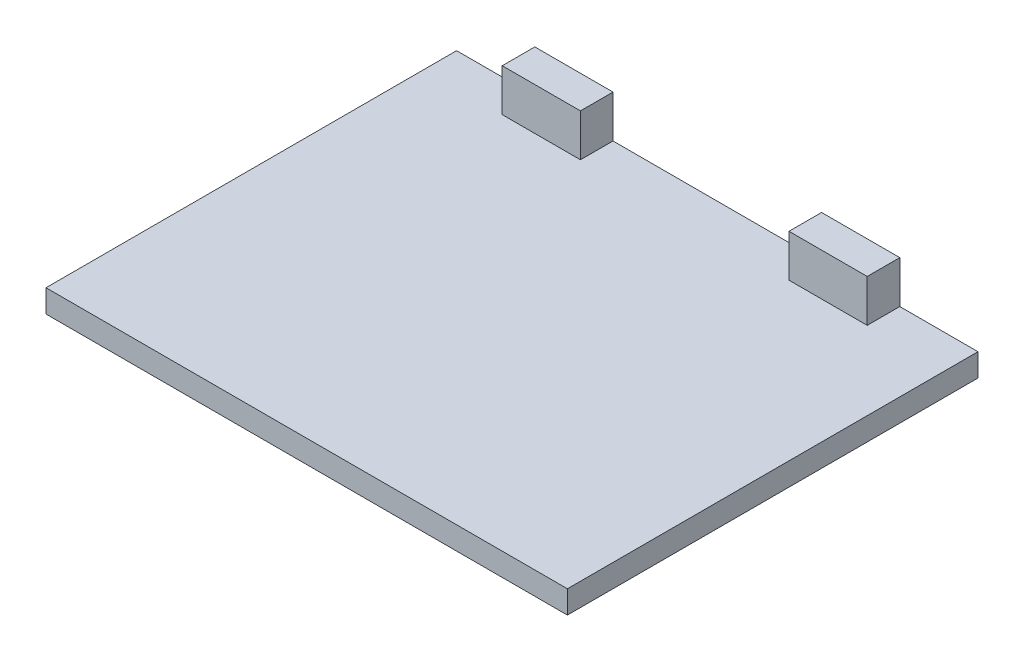
ISO-10303-21;
HEADER;
FILE_DESCRIPTION(('STEP AP214'),'2;1');
FILE_NAME('part.step','',(''),(''),'','','');
FILE_SCHEMA(('AUTOMOTIVE_DESIGN { 1 0 10303 214 1 1 1 1 }'));
ENDSEC;
DATA;
#1=APPLICATION_CONTEXT('core data for automotive mechanical design processes');
#2=APPLICATION_PROTOCOL_DEFINITION('international standard','automotive_design',2000,#1);
#3=PRODUCT_CONTEXT('',#1,'mechanical');
#4=PRODUCT('Part','Part','',(#3));
#5=PRODUCT_RELATED_PRODUCT_CATEGORY('part','',(#4));
#6=PRODUCT_DEFINITION_FORMATION('','',#4);
#7=PRODUCT_DEFINITION_CONTEXT('part definition',#1,'design');
#8=PRODUCT_DEFINITION('design','',#6,#7);
#9=PRODUCT_DEFINITION_SHAPE('','',#8);
#10=(LENGTH_UNIT() NAMED_UNIT(*) SI_UNIT(.MILLI.,.METRE.));
#11=(NAMED_UNIT(*) PLANE_ANGLE_UNIT() SI_UNIT($,.RADIAN.));
#12=(NAMED_UNIT(*) SI_UNIT($,.STERADIAN.) SOLID_ANGLE_UNIT());
#13=UNCERTAINTY_MEASURE_WITH_UNIT(LENGTH_MEASURE(1.E-05),#10,'distance_accuracy_value','');
#14=(GEOMETRIC_REPRESENTATION_CONTEXT(3) GLOBAL_UNCERTAINTY_ASSIGNED_CONTEXT((#13)) GLOBAL_UNIT_ASSIGNED_CONTEXT((#10,
#11,#12)) REPRESENTATION_CONTEXT('',''));
#15=CARTESIAN_POINT('',(0.,0.,0.));
#16=DIRECTION('',(0.,0.,1.));
#17=DIRECTION('',(1.,0.,0.));
#18=AXIS2_PLACEMENT_3D('',#15,#16,#17);
#19=CARTESIAN_POINT('',(0.,3.5,0.));
#20=DIRECTION('',(1.,0.,0.));
#21=DIRECTION('',(0.,0.,-1.));
#22=AXIS2_PLACEMENT_3D('',#19,#20,#21);
#23=PLANE('',#22);
#24=DIRECTION('',(0.,0.,1.));
#25=VECTOR('',#24,1.);
#26=CARTESIAN_POINT('',(0.,0.,0.));
#27=LINE('',#26,#25);
#28=CARTESIAN_POINT('',(0.,0.,-63.));
#29=VERTEX_POINT('',#28);
#30=CARTESIAN_POINT('',(0.,0.,0.));
#31=VERTEX_POINT('',#30);
#32=EDGE_CURVE('E277',#29,#31,#27,.T.);
#33=ORIENTED_EDGE('',*,*,#32,.T.);
#34=DIRECTION('',(0.,-1.,0.));
#35=VECTOR('',#34,1.);
#36=CARTESIAN_POINT('',(0.,3.5,0.));
#37=LINE('',#36,#35);
#38=CARTESIAN_POINT('',(0.,3.5,0.));
#39=VERTEX_POINT('',#38);
#40=EDGE_CURVE('E12',#39,#31,#37,.T.);
#41=ORIENTED_EDGE('',*,*,#40,.F.);
#42=DIRECTION('',(0.,0.,1.));
#43=VECTOR('',#42,1.);
#44=CARTESIAN_POINT('',(0.,3.5,0.));
#45=LINE('',#44,#43);
#46=CARTESIAN_POINT('',(0.,3.5,-63.));
#47=VERTEX_POINT('',#46);
#48=EDGE_CURVE('E281',#47,#39,#45,.T.);
#49=ORIENTED_EDGE('',*,*,#48,.F.);
#50=DIRECTION('',(0.,-1.,0.));
#51=VECTOR('',#50,1.);
#52=CARTESIAN_POINT('',(0.,3.5,-63.));
#53=LINE('',#52,#51);
#54=EDGE_CURVE('E185',#47,#29,#53,.T.);
#55=ORIENTED_EDGE('',*,*,#54,.T.);
#56=EDGE_LOOP('',(#33,#41,#49,#55));
#57=FACE_BOUND('',#56,.T.);
#58=ADVANCED_FACE('F91',(#57),#23,.F.);
#59=CARTESIAN_POINT('',(0.,3.5,0.));
#60=DIRECTION('',(0.,0.,-1.));
#61=DIRECTION('',(-1.,0.,0.));
#62=AXIS2_PLACEMENT_3D('',#59,#60,#61);
#63=PLANE('',#62);
#64=DIRECTION('',(1.,0.,0.));
#65=VECTOR('',#64,1.);
#66=CARTESIAN_POINT('',(0.,0.,0.));
#67=LINE('',#66,#65);
#68=CARTESIAN_POINT('',(80.,0.,0.));
#69=VERTEX_POINT('',#68);
#70=EDGE_CURVE('E118',#31,#69,#67,.T.);
#71=ORIENTED_EDGE('',*,*,#70,.T.);
#72=DIRECTION('',(0.,-1.,0.));
#73=VECTOR('',#72,1.);
#74=CARTESIAN_POINT('',(80.,3.5,0.));
#75=LINE('',#74,#73);
#76=CARTESIAN_POINT('',(80.,3.5,0.));
#77=VERTEX_POINT('',#76);
#78=EDGE_CURVE('E99',#77,#69,#75,.T.);
#79=ORIENTED_EDGE('',*,*,#78,.F.);
#80=DIRECTION('',(1.,0.,0.));
#81=VECTOR('',#80,1.);
#82=CARTESIAN_POINT('',(0.,3.5,0.));
#83=LINE('',#82,#81);
#84=EDGE_CURVE('E107',#39,#77,#83,.T.);
#85=ORIENTED_EDGE('',*,*,#84,.F.);
#86=ORIENTED_EDGE('',*,*,#40,.T.);
#87=EDGE_LOOP('',(#71,#79,#85,#86));
#88=FACE_BOUND('',#87,.T.);
#89=ADVANCED_FACE('F313',(#88),#63,.F.);
#90=CARTESIAN_POINT('',(80.,3.5,0.));
#91=DIRECTION('',(-1.,0.,0.));
#92=DIRECTION('',(0.,0.,1.));
#93=AXIS2_PLACEMENT_3D('',#90,#91,#92);
#94=PLANE('',#93);
#95=DIRECTION('',(0.,0.,-1.));
#96=VECTOR('',#95,1.);
#97=CARTESIAN_POINT('',(80.,0.,0.));
#98=LINE('',#97,#96);
#99=CARTESIAN_POINT('',(80.,0.,-63.));
#100=VERTEX_POINT('',#99);
#101=EDGE_CURVE('E181',#69,#100,#98,.T.);
#102=ORIENTED_EDGE('',*,*,#101,.T.);
#103=DIRECTION('',(0.,-1.,0.));
#104=VECTOR('',#103,1.);
#105=CARTESIAN_POINT('',(80.,3.5,-63.));
#106=LINE('',#105,#104);
#107=CARTESIAN_POINT('',(80.,3.5,-63.));
#108=VERTEX_POINT('',#107);
#109=EDGE_CURVE('E179',#108,#100,#106,.T.);
#110=ORIENTED_EDGE('',*,*,#109,.F.);
#111=DIRECTION('',(0.,0.,-1.));
#112=VECTOR('',#111,1.);
#113=CARTESIAN_POINT('',(80.,3.5,0.));
#114=LINE('',#113,#112);
#115=EDGE_CURVE('E167',#77,#108,#114,.T.);
#116=ORIENTED_EDGE('',*,*,#115,.F.);
#117=ORIENTED_EDGE('',*,*,#78,.T.);
#118=EDGE_LOOP('',(#102,#110,#116,#117));
#119=FACE_BOUND('',#118,.T.);
#120=ADVANCED_FACE('F180',(#119),#94,.F.);
#121=CARTESIAN_POINT('',(0.,3.5,0.));
#122=DIRECTION('',(0.,-1.,0.));
#123=DIRECTION('',(0.,0.,-1.));
#124=AXIS2_PLACEMENT_3D('',#121,#122,#123);
#125=PLANE('',#124);
#126=ORIENTED_EDGE('',*,*,#48,.T.);
#127=ORIENTED_EDGE('',*,*,#84,.T.);
#128=ORIENTED_EDGE('',*,*,#115,.T.);
#129=DIRECTION('',(-1.,0.,0.));
#130=VECTOR('',#129,1.);
#131=CARTESIAN_POINT('',(80.,3.5,-63.));
#132=LINE('',#131,#130);
#133=CARTESIAN_POINT('',(68.,3.5,-63.));
#134=VERTEX_POINT('',#133);
#135=EDGE_CURVE('E172',#108,#134,#132,.T.);
#136=ORIENTED_EDGE('',*,*,#135,.T.);
#137=DIRECTION('',(0.,0.,1.));
#138=VECTOR('',#137,1.);
#139=CARTESIAN_POINT('',(68.,3.5,-63.));
#140=LINE('',#139,#138);
#141=CARTESIAN_POINT('',(68.,3.5,-58.));
#142=VERTEX_POINT('',#141);
#143=EDGE_CURVE('E207',#134,#142,#140,.T.);
#144=ORIENTED_EDGE('',*,*,#143,.T.);
#145=DIRECTION('',(-1.,0.,0.));
#146=VECTOR('',#145,1.);
#147=CARTESIAN_POINT('',(0.,3.5,-58.));
#148=LINE('',#147,#146);
#149=CARTESIAN_POINT('',(56.,3.5,-58.));
#150=VERTEX_POINT('',#149);
#151=EDGE_CURVE('E285',#142,#150,#148,.T.);
#152=ORIENTED_EDGE('',*,*,#151,.T.);
#153=DIRECTION('',(0.,0.,1.));
#154=VECTOR('',#153,1.);
#155=CARTESIAN_POINT('',(56.,3.5,-63.));
#156=LINE('',#155,#154);
#157=CARTESIAN_POINT('',(56.,3.5,-63.));
#158=VERTEX_POINT('',#157);
#159=EDGE_CURVE('E238',#158,#150,#156,.T.);
#160=ORIENTED_EDGE('',*,*,#159,.F.);
#161=CARTESIAN_POINT('',(24.,3.5,-63.));
#162=VERTEX_POINT('',#161);
#163=EDGE_CURVE('E191',#158,#162,#132,.T.);
#164=ORIENTED_EDGE('',*,*,#163,.T.);
#165=DIRECTION('',(0.,0.,1.));
#166=VECTOR('',#165,1.);
#167=CARTESIAN_POINT('',(24.,3.5,-63.));
#168=LINE('',#167,#166);
#169=CARTESIAN_POINT('',(24.,3.5,-58.));
#170=VERTEX_POINT('',#169);
#171=EDGE_CURVE('E255',#162,#170,#168,.T.);
#172=ORIENTED_EDGE('',*,*,#171,.T.);
#173=CARTESIAN_POINT('',(12.,3.5,-58.));
#174=VERTEX_POINT('',#173);
#175=EDGE_CURVE('E176',#170,#174,#148,.T.);
#176=ORIENTED_EDGE('',*,*,#175,.T.);
#177=DIRECTION('',(0.,0.,1.));
#178=VECTOR('',#177,1.);
#179=CARTESIAN_POINT('',(12.,3.5,-63.));
#180=LINE('',#179,#178);
#181=CARTESIAN_POINT('',(12.,3.5,-63.));
#182=VERTEX_POINT('',#181);
#183=EDGE_CURVE('E125',#182,#174,#180,.T.);
#184=ORIENTED_EDGE('',*,*,#183,.F.);
#185=EDGE_CURVE('E193',#182,#47,#132,.T.);
#186=ORIENTED_EDGE('',*,*,#185,.T.);
#187=EDGE_LOOP('',(#126,#127,#128,#136,#144,#152,#160,#164,#172,#176,#184,#186));
#188=FACE_BOUND('',#187,.T.);
#189=ADVANCED_FACE('F169',(#188),#125,.F.);
#190=CARTESIAN_POINT('',(0.,0.,0.));
#191=DIRECTION('',(0.,-1.,0.));
#192=DIRECTION('',(0.,0.,-1.));
#193=AXIS2_PLACEMENT_3D('',#190,#191,#192);
#194=PLANE('',#193);
#195=ORIENTED_EDGE('',*,*,#32,.F.);
#196=DIRECTION('',(-1.,0.,0.));
#197=VECTOR('',#196,1.);
#198=CARTESIAN_POINT('',(0.,0.,-63.));
#199=LINE('',#198,#197);
#200=EDGE_CURVE('E244',#100,#29,#199,.T.);
#201=ORIENTED_EDGE('',*,*,#200,.F.);
#202=ORIENTED_EDGE('',*,*,#101,.F.);
#203=ORIENTED_EDGE('',*,*,#70,.F.);
#204=EDGE_LOOP('',(#195,#201,#202,#203));
#205=FACE_BOUND('',#204,.T.);
#206=ADVANCED_FACE('F319',(#205),#194,.T.);
#207=CARTESIAN_POINT('',(0.,0.,-58.));
#208=DIRECTION('',(0.,0.,-1.));
#209=DIRECTION('',(-1.,0.,0.));
#210=AXIS2_PLACEMENT_3D('',#207,#208,#209);
#211=PLANE('',#210);
#212=ORIENTED_EDGE('',*,*,#151,.F.);
#213=DIRECTION('',(0.,1.,0.));
#214=VECTOR('',#213,1.);
#215=CARTESIAN_POINT('',(68.,0.,-58.));
#216=LINE('',#215,#214);
#217=CARTESIAN_POINT('',(68.,10.,-58.));
#218=VERTEX_POINT('',#217);
#219=EDGE_CURVE('E211',#142,#218,#216,.T.);
#220=ORIENTED_EDGE('',*,*,#219,.T.);
#221=DIRECTION('',(-1.,0.,0.));
#222=VECTOR('',#221,1.);
#223=CARTESIAN_POINT('',(0.,10.,-58.));
#224=LINE('',#223,#222);
#225=CARTESIAN_POINT('',(56.,10.,-58.));
#226=VERTEX_POINT('',#225);
#227=EDGE_CURVE('E194',#218,#226,#224,.T.);
#228=ORIENTED_EDGE('',*,*,#227,.T.);
#229=DIRECTION('',(0.,1.,0.));
#230=VECTOR('',#229,1.);
#231=CARTESIAN_POINT('',(56.,0.,-58.));
#232=LINE('',#231,#230);
#233=EDGE_CURVE('E190',#150,#226,#232,.T.);
#234=ORIENTED_EDGE('',*,*,#233,.F.);
#235=EDGE_LOOP('',(#212,#220,#228,#234));
#236=FACE_BOUND('',#235,.T.);
#237=ADVANCED_FACE('F292',(#236),#211,.F.);
#238=ORIENTED_EDGE('',*,*,#175,.F.);
#239=DIRECTION('',(0.,1.,0.));
#240=VECTOR('',#239,1.);
#241=CARTESIAN_POINT('',(24.,0.,-58.));
#242=LINE('',#241,#240);
#243=CARTESIAN_POINT('',(24.,10.,-58.));
#244=VERTEX_POINT('',#243);
#245=EDGE_CURVE('E235',#170,#244,#242,.T.);
#246=ORIENTED_EDGE('',*,*,#245,.T.);
#247=DIRECTION('',(1.,0.,0.));
#248=VECTOR('',#247,1.);
#249=CARTESIAN_POINT('',(0.,10.,-58.));
#250=LINE('',#249,#248);
#251=CARTESIAN_POINT('',(12.,10.,-58.));
#252=VERTEX_POINT('',#251);
#253=EDGE_CURVE('E228',#252,#244,#250,.T.);
#254=ORIENTED_EDGE('',*,*,#253,.F.);
#255=DIRECTION('',(0.,1.,0.));
#256=VECTOR('',#255,1.);
#257=CARTESIAN_POINT('',(12.,0.,-58.));
#258=LINE('',#257,#256);
#259=EDGE_CURVE('E232',#174,#252,#258,.T.);
#260=ORIENTED_EDGE('',*,*,#259,.F.);
#261=EDGE_LOOP('',(#238,#246,#254,#260));
#262=FACE_BOUND('',#261,.T.);
#263=ADVANCED_FACE('F270',(#262),#211,.F.);
#264=CARTESIAN_POINT('',(0.,0.,-63.));
#265=DIRECTION('',(0.,0.,-1.));
#266=DIRECTION('',(-1.,0.,0.));
#267=AXIS2_PLACEMENT_3D('',#264,#265,#266);
#268=PLANE('',#267);
#269=ORIENTED_EDGE('',*,*,#200,.T.);
#270=ORIENTED_EDGE('',*,*,#54,.F.);
#271=ORIENTED_EDGE('',*,*,#185,.F.);
#272=DIRECTION('',(0.,1.,0.));
#273=VECTOR('',#272,1.);
#274=CARTESIAN_POINT('',(12.,0.,-63.));
#275=LINE('',#274,#273);
#276=CARTESIAN_POINT('',(12.,10.,-63.));
#277=VERTEX_POINT('',#276);
#278=EDGE_CURVE('E241',#182,#277,#275,.T.);
#279=ORIENTED_EDGE('',*,*,#278,.T.);
#280=DIRECTION('',(1.,0.,0.));
#281=VECTOR('',#280,1.);
#282=CARTESIAN_POINT('',(0.,10.,-63.));
#283=LINE('',#282,#281);
#284=CARTESIAN_POINT('',(24.,10.,-63.));
#285=VERTEX_POINT('',#284);
#286=EDGE_CURVE('E227',#277,#285,#283,.T.);
#287=ORIENTED_EDGE('',*,*,#286,.T.);
#288=DIRECTION('',(0.,1.,0.));
#289=VECTOR('',#288,1.);
#290=CARTESIAN_POINT('',(24.,0.,-63.));
#291=LINE('',#290,#289);
#292=EDGE_CURVE('E231',#162,#285,#291,.T.);
#293=ORIENTED_EDGE('',*,*,#292,.F.);
#294=ORIENTED_EDGE('',*,*,#163,.F.);
#295=DIRECTION('',(0.,1.,0.));
#296=VECTOR('',#295,1.);
#297=CARTESIAN_POINT('',(56.,0.,-63.));
#298=LINE('',#297,#296);
#299=CARTESIAN_POINT('',(56.,10.,-63.));
#300=VERTEX_POINT('',#299);
#301=EDGE_CURVE('E213',#158,#300,#298,.T.);
#302=ORIENTED_EDGE('',*,*,#301,.T.);
#303=DIRECTION('',(-1.,0.,0.));
#304=VECTOR('',#303,1.);
#305=CARTESIAN_POINT('',(0.,10.,-63.));
#306=LINE('',#305,#304);
#307=CARTESIAN_POINT('',(68.,10.,-63.));
#308=VERTEX_POINT('',#307);
#309=EDGE_CURVE('E217',#308,#300,#306,.T.);
#310=ORIENTED_EDGE('',*,*,#309,.F.);
#311=DIRECTION('',(0.,1.,0.));
#312=VECTOR('',#311,1.);
#313=CARTESIAN_POINT('',(68.,0.,-63.));
#314=LINE('',#313,#312);
#315=EDGE_CURVE('E189',#134,#308,#314,.T.);
#316=ORIENTED_EDGE('',*,*,#315,.F.);
#317=ORIENTED_EDGE('',*,*,#135,.F.);
#318=ORIENTED_EDGE('',*,*,#109,.T.);
#319=EDGE_LOOP('',(#269,#270,#271,#279,#287,#293,#294,#302,#310,#316,#317,#318));
#320=FACE_BOUND('',#319,.T.);
#321=ADVANCED_FACE('F187',(#320),#268,.T.);
#322=CARTESIAN_POINT('',(12.,0.,-63.));
#323=DIRECTION('',(1.,0.,0.));
#324=DIRECTION('',(0.,0.,-1.));
#325=AXIS2_PLACEMENT_3D('',#322,#323,#324);
#326=PLANE('',#325);
#327=ORIENTED_EDGE('',*,*,#278,.F.);
#328=ORIENTED_EDGE('',*,*,#183,.T.);
#329=ORIENTED_EDGE('',*,*,#259,.T.);
#330=DIRECTION('',(0.,0.,1.));
#331=VECTOR('',#330,1.);
#332=CARTESIAN_POINT('',(12.,10.,-63.));
#333=LINE('',#332,#331);
#334=EDGE_CURVE('E221',#277,#252,#333,.T.);
#335=ORIENTED_EDGE('',*,*,#334,.F.);
#336=EDGE_LOOP('',(#327,#328,#329,#335));
#337=FACE_BOUND('',#336,.T.);
#338=ADVANCED_FACE('F275',(#337),#326,.F.);
#339=CARTESIAN_POINT('',(0.,10.,-63.));
#340=DIRECTION('',(0.,-1.,0.));
#341=DIRECTION('',(0.,0.,-1.));
#342=AXIS2_PLACEMENT_3D('',#339,#340,#341);
#343=PLANE('',#342);
#344=ORIENTED_EDGE('',*,*,#253,.T.);
#345=DIRECTION('',(0.,0.,1.));
#346=VECTOR('',#345,1.);
#347=CARTESIAN_POINT('',(24.,10.,-63.));
#348=LINE('',#347,#346);
#349=EDGE_CURVE('E224',#285,#244,#348,.T.);
#350=ORIENTED_EDGE('',*,*,#349,.F.);
#351=ORIENTED_EDGE('',*,*,#286,.F.);
#352=ORIENTED_EDGE('',*,*,#334,.T.);
#353=EDGE_LOOP('',(#344,#350,#351,#352));
#354=FACE_BOUND('',#353,.T.);
#355=ADVANCED_FACE('F264',(#354),#343,.F.);
#356=CARTESIAN_POINT('',(24.,0.,-63.));
#357=DIRECTION('',(1.,0.,0.));
#358=DIRECTION('',(0.,0.,-1.));
#359=AXIS2_PLACEMENT_3D('',#356,#357,#358);
#360=PLANE('',#359);
#361=ORIENTED_EDGE('',*,*,#171,.F.);
#362=ORIENTED_EDGE('',*,*,#292,.T.);
#363=ORIENTED_EDGE('',*,*,#349,.T.);
#364=ORIENTED_EDGE('',*,*,#245,.F.);
#365=EDGE_LOOP('',(#361,#362,#363,#364));
#366=FACE_BOUND('',#365,.T.);
#367=ADVANCED_FACE('F250',(#366),#360,.T.);
#368=CARTESIAN_POINT('',(68.,0.,-63.));
#369=DIRECTION('',(1.,0.,0.));
#370=DIRECTION('',(0.,0.,-1.));
#371=AXIS2_PLACEMENT_3D('',#368,#369,#370);
#372=PLANE('',#371);
#373=ORIENTED_EDGE('',*,*,#143,.F.);
#374=ORIENTED_EDGE('',*,*,#315,.T.);
#375=DIRECTION('',(0.,0.,1.));
#376=VECTOR('',#375,1.);
#377=CARTESIAN_POINT('',(68.,10.,-63.));
#378=LINE('',#377,#376);
#379=EDGE_CURVE('E208',#308,#218,#378,.T.);
#380=ORIENTED_EDGE('',*,*,#379,.T.);
#381=ORIENTED_EDGE('',*,*,#219,.F.);
#382=EDGE_LOOP('',(#373,#374,#380,#381));
#383=FACE_BOUND('',#382,.T.);
#384=ADVANCED_FACE('F302',(#383),#372,.T.);
#385=CARTESIAN_POINT('',(0.,10.,-63.));
#386=DIRECTION('',(0.,1.,0.));
#387=DIRECTION('',(0.,0.,1.));
#388=AXIS2_PLACEMENT_3D('',#385,#386,#387);
#389=PLANE('',#388);
#390=ORIENTED_EDGE('',*,*,#227,.F.);
#391=ORIENTED_EDGE('',*,*,#379,.F.);
#392=ORIENTED_EDGE('',*,*,#309,.T.);
#393=DIRECTION('',(0.,0.,1.));
#394=VECTOR('',#393,1.);
#395=CARTESIAN_POINT('',(56.,10.,-63.));
#396=LINE('',#395,#394);
#397=EDGE_CURVE('E204',#300,#226,#396,.T.);
#398=ORIENTED_EDGE('',*,*,#397,.T.);
#399=EDGE_LOOP('',(#390,#391,#392,#398));
#400=FACE_BOUND('',#399,.T.);
#401=ADVANCED_FACE('F299',(#400),#389,.T.);
#402=CARTESIAN_POINT('',(56.,0.,-63.));
#403=DIRECTION('',(1.,0.,0.));
#404=DIRECTION('',(0.,0.,-1.));
#405=AXIS2_PLACEMENT_3D('',#402,#403,#404);
#406=PLANE('',#405);
#407=ORIENTED_EDGE('',*,*,#301,.F.);
#408=ORIENTED_EDGE('',*,*,#159,.T.);
#409=ORIENTED_EDGE('',*,*,#233,.T.);
#410=ORIENTED_EDGE('',*,*,#397,.F.);
#411=EDGE_LOOP('',(#407,#408,#409,#410));
#412=FACE_BOUND('',#411,.T.);
#413=ADVANCED_FACE('F297',(#412),#406,.F.);
#414=CLOSED_SHELL('',(#58,#89,#120,#189,#206,#237,#263,#321,#338,#355,#367,#384,#401,#413));
#415=MANIFOLD_SOLID_BREP('B2',#414);
#416=ADVANCED_BREP_SHAPE_REPRESENTATION('',(#18,#415),#14);
#417=SHAPE_DEFINITION_REPRESENTATION(#9,#416);
ENDSEC;
END-ISO-10303-21;
